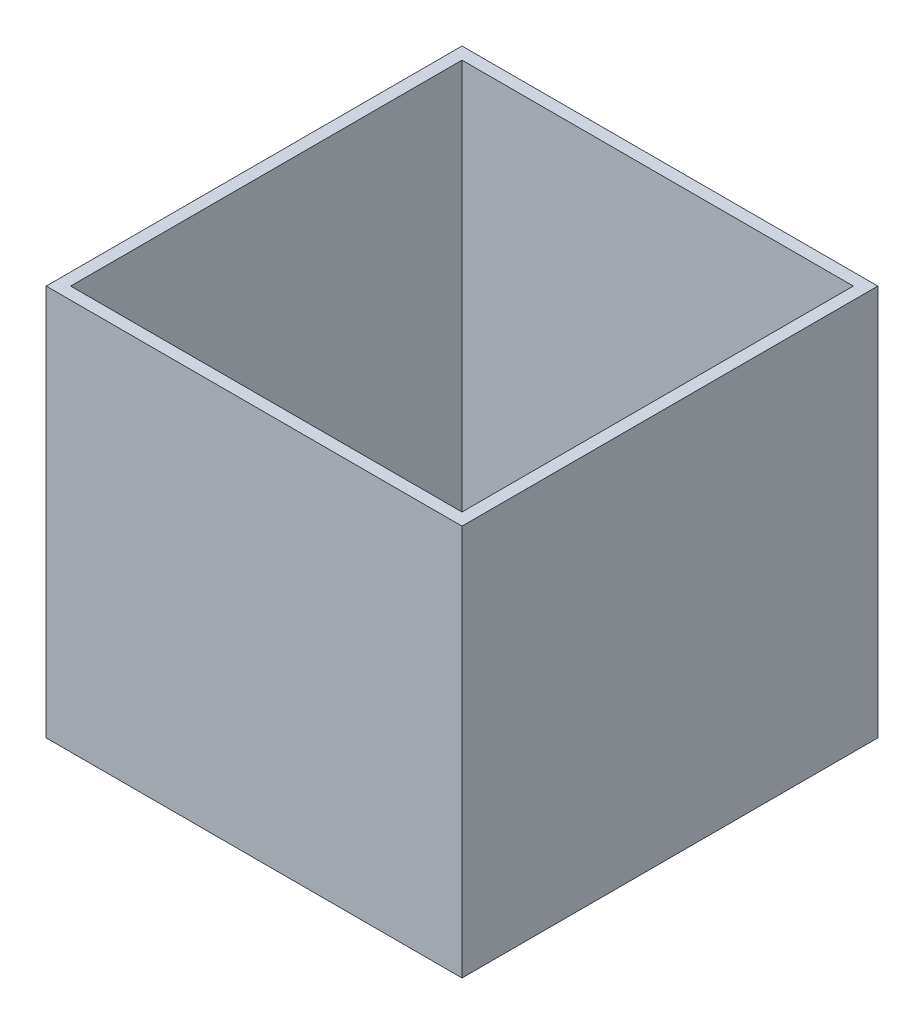
ISO-10303-21;
HEADER;
FILE_DESCRIPTION(('STEP AP214'),'2;1');
FILE_NAME('part.step','',(''),(''),'','','');
FILE_SCHEMA(('AUTOMOTIVE_DESIGN { 1 0 10303 214 1 1 1 1 }'));
ENDSEC;
DATA;
#1=APPLICATION_CONTEXT('core data for automotive mechanical design processes');
#2=APPLICATION_PROTOCOL_DEFINITION('international standard','automotive_design',2000,#1);
#3=PRODUCT_CONTEXT('',#1,'mechanical');
#4=PRODUCT('Part','Part','',(#3));
#5=PRODUCT_RELATED_PRODUCT_CATEGORY('part','',(#4));
#6=PRODUCT_DEFINITION_FORMATION('','',#4);
#7=PRODUCT_DEFINITION_CONTEXT('part definition',#1,'design');
#8=PRODUCT_DEFINITION('design','',#6,#7);
#9=PRODUCT_DEFINITION_SHAPE('','',#8);
#10=(LENGTH_UNIT() NAMED_UNIT(*) SI_UNIT(.MILLI.,.METRE.));
#11=(NAMED_UNIT(*) PLANE_ANGLE_UNIT() SI_UNIT($,.RADIAN.));
#12=(NAMED_UNIT(*) SI_UNIT($,.STERADIAN.) SOLID_ANGLE_UNIT());
#13=UNCERTAINTY_MEASURE_WITH_UNIT(LENGTH_MEASURE(1.E-05),#10,'distance_accuracy_value','');
#14=(GEOMETRIC_REPRESENTATION_CONTEXT(3) GLOBAL_UNCERTAINTY_ASSIGNED_CONTEXT((#13)) GLOBAL_UNIT_ASSIGNED_CONTEXT((#10,
#11,#12)) REPRESENTATION_CONTEXT('',''));
#15=CARTESIAN_POINT('',(0.,0.,0.));
#16=DIRECTION('',(0.,0.,1.));
#17=DIRECTION('',(1.,0.,0.));
#18=AXIS2_PLACEMENT_3D('',#15,#16,#17);
#19=CARTESIAN_POINT('',(0.,203.2,0.));
#20=DIRECTION('',(0.,1.,0.));
#21=DIRECTION('',(0.,0.,1.));
#22=AXIS2_PLACEMENT_3D('',#19,#20,#21);
#23=PLANE('',#22);
#24=DIRECTION('',(0.,0.,1.));
#25=VECTOR('',#24,1.);
#26=CARTESIAN_POINT('',(-107.95,203.2,-107.95));
#27=LINE('',#26,#25);
#28=CARTESIAN_POINT('',(-107.95,203.2,-107.95));
#29=VERTEX_POINT('',#28);
#30=CARTESIAN_POINT('',(-107.95,203.2,107.95));
#31=VERTEX_POINT('',#30);
#32=EDGE_CURVE('E137',#29,#31,#27,.T.);
#33=ORIENTED_EDGE('',*,*,#32,.T.);
#34=DIRECTION('',(1.,0.,0.));
#35=VECTOR('',#34,1.);
#36=CARTESIAN_POINT('',(-107.95,203.2,107.95));
#37=LINE('',#36,#35);
#38=CARTESIAN_POINT('',(107.95,203.2,107.95));
#39=VERTEX_POINT('',#38);
#40=EDGE_CURVE('E140',#31,#39,#37,.T.);
#41=ORIENTED_EDGE('',*,*,#40,.T.);
#42=DIRECTION('',(0.,0.,-1.));
#43=VECTOR('',#42,1.);
#44=CARTESIAN_POINT('',(107.95,203.2,-107.95));
#45=LINE('',#44,#43);
#46=CARTESIAN_POINT('',(107.95,203.2,-107.95));
#47=VERTEX_POINT('',#46);
#48=EDGE_CURVE('E143',#39,#47,#45,.T.);
#49=ORIENTED_EDGE('',*,*,#48,.T.);
#50=DIRECTION('',(-1.,0.,0.));
#51=VECTOR('',#50,1.);
#52=CARTESIAN_POINT('',(-107.95,203.2,-107.95));
#53=LINE('',#52,#51);
#54=EDGE_CURVE('E145',#47,#29,#53,.T.);
#55=ORIENTED_EDGE('',*,*,#54,.T.);
#56=EDGE_LOOP('',(#33,#41,#49,#55));
#57=FACE_BOUND('',#56,.T.);
#58=DIRECTION('',(1.,0.,0.));
#59=VECTOR('',#58,1.);
#60=CARTESIAN_POINT('',(-101.6,203.2,101.6));
#61=LINE('',#60,#59);
#62=CARTESIAN_POINT('',(-101.6,203.2,101.6));
#63=VERTEX_POINT('',#62);
#64=CARTESIAN_POINT('',(101.6,203.2,101.6));
#65=VERTEX_POINT('',#64);
#66=EDGE_CURVE('E109',#63,#65,#61,.T.);
#67=ORIENTED_EDGE('',*,*,#66,.F.);
#68=DIRECTION('',(0.,0.,1.));
#69=VECTOR('',#68,1.);
#70=CARTESIAN_POINT('',(-101.6,203.2,-101.6));
#71=LINE('',#70,#69);
#72=CARTESIAN_POINT('',(-101.6,203.2,-101.6));
#73=VERTEX_POINT('',#72);
#74=EDGE_CURVE('E101',#73,#63,#71,.T.);
#75=ORIENTED_EDGE('',*,*,#74,.F.);
#76=DIRECTION('',(-1.,0.,0.));
#77=VECTOR('',#76,1.);
#78=CARTESIAN_POINT('',(-101.6,203.2,-101.6));
#79=LINE('',#78,#77);
#80=CARTESIAN_POINT('',(101.6,203.2,-101.6));
#81=VERTEX_POINT('',#80);
#82=EDGE_CURVE('E123',#81,#73,#79,.T.);
#83=ORIENTED_EDGE('',*,*,#82,.F.);
#84=DIRECTION('',(0.,0.,-1.));
#85=VECTOR('',#84,1.);
#86=CARTESIAN_POINT('',(101.6,203.2,-101.6));
#87=LINE('',#86,#85);
#88=EDGE_CURVE('E121',#65,#81,#87,.T.);
#89=ORIENTED_EDGE('',*,*,#88,.F.);
#90=EDGE_LOOP('',(#67,#75,#83,#89));
#91=FACE_BOUND('',#90,.T.);
#92=ADVANCED_FACE('F36',(#57,#91),#23,.T.);
#93=CARTESIAN_POINT('',(0.,0.,0.));
#94=DIRECTION('',(0.,1.,0.));
#95=DIRECTION('',(0.,0.,1.));
#96=AXIS2_PLACEMENT_3D('',#93,#94,#95);
#97=PLANE('',#96);
#98=DIRECTION('',(0.,0.,1.));
#99=VECTOR('',#98,1.);
#100=CARTESIAN_POINT('',(-107.95,0.,-107.95));
#101=LINE('',#100,#99);
#102=CARTESIAN_POINT('',(-107.95,0.,-107.95));
#103=VERTEX_POINT('',#102);
#104=CARTESIAN_POINT('',(-107.95,0.,107.95));
#105=VERTEX_POINT('',#104);
#106=EDGE_CURVE('E117',#103,#105,#101,.T.);
#107=ORIENTED_EDGE('',*,*,#106,.F.);
#108=DIRECTION('',(-1.,0.,0.));
#109=VECTOR('',#108,1.);
#110=CARTESIAN_POINT('',(-107.95,0.,-107.95));
#111=LINE('',#110,#109);
#112=CARTESIAN_POINT('',(107.95,0.,-107.95));
#113=VERTEX_POINT('',#112);
#114=EDGE_CURVE('E141',#113,#103,#111,.T.);
#115=ORIENTED_EDGE('',*,*,#114,.F.);
#116=DIRECTION('',(0.,0.,-1.));
#117=VECTOR('',#116,1.);
#118=CARTESIAN_POINT('',(107.95,0.,-107.95));
#119=LINE('',#118,#117);
#120=CARTESIAN_POINT('',(107.95,0.,107.95));
#121=VERTEX_POINT('',#120);
#122=EDGE_CURVE('E152',#121,#113,#119,.T.);
#123=ORIENTED_EDGE('',*,*,#122,.F.);
#124=DIRECTION('',(1.,0.,0.));
#125=VECTOR('',#124,1.);
#126=CARTESIAN_POINT('',(-107.95,0.,107.95));
#127=LINE('',#126,#125);
#128=EDGE_CURVE('E150',#105,#121,#127,.T.);
#129=ORIENTED_EDGE('',*,*,#128,.F.);
#130=EDGE_LOOP('',(#107,#115,#123,#129));
#131=FACE_BOUND('',#130,.T.);
#132=DIRECTION('',(0.,0.,1.));
#133=VECTOR('',#132,1.);
#134=CARTESIAN_POINT('',(-101.6,0.,-101.6));
#135=LINE('',#134,#133);
#136=CARTESIAN_POINT('',(-101.6,0.,-101.6));
#137=VERTEX_POINT('',#136);
#138=CARTESIAN_POINT('',(-101.6,0.,101.6));
#139=VERTEX_POINT('',#138);
#140=EDGE_CURVE('E59',#137,#139,#135,.T.);
#141=ORIENTED_EDGE('',*,*,#140,.T.);
#142=DIRECTION('',(1.,0.,0.));
#143=VECTOR('',#142,1.);
#144=CARTESIAN_POINT('',(-101.6,0.,101.6));
#145=LINE('',#144,#143);
#146=CARTESIAN_POINT('',(101.6,0.,101.6));
#147=VERTEX_POINT('',#146);
#148=EDGE_CURVE('E116',#139,#147,#145,.T.);
#149=ORIENTED_EDGE('',*,*,#148,.T.);
#150=DIRECTION('',(0.,0.,-1.));
#151=VECTOR('',#150,1.);
#152=CARTESIAN_POINT('',(101.6,0.,-101.6));
#153=LINE('',#152,#151);
#154=CARTESIAN_POINT('',(101.6,0.,-101.6));
#155=VERTEX_POINT('',#154);
#156=EDGE_CURVE('E129',#147,#155,#153,.T.);
#157=ORIENTED_EDGE('',*,*,#156,.T.);
#158=DIRECTION('',(-1.,0.,0.));
#159=VECTOR('',#158,1.);
#160=CARTESIAN_POINT('',(-101.6,0.,-101.6));
#161=LINE('',#160,#159);
#162=EDGE_CURVE('E110',#155,#137,#161,.T.);
#163=ORIENTED_EDGE('',*,*,#162,.T.);
#164=EDGE_LOOP('',(#141,#149,#157,#163));
#165=FACE_BOUND('',#164,.T.);
#166=ADVANCED_FACE('F170',(#131,#165),#97,.F.);
#167=CARTESIAN_POINT('',(-107.95,203.2,-107.95));
#168=DIRECTION('',(1.,0.,0.));
#169=DIRECTION('',(0.,0.,-1.));
#170=AXIS2_PLACEMENT_3D('',#167,#168,#169);
#171=PLANE('',#170);
#172=ORIENTED_EDGE('',*,*,#106,.T.);
#173=DIRECTION('',(0.,-1.,0.));
#174=VECTOR('',#173,1.);
#175=CARTESIAN_POINT('',(-107.95,203.2,107.95));
#176=LINE('',#175,#174);
#177=EDGE_CURVE('E11',#31,#105,#176,.T.);
#178=ORIENTED_EDGE('',*,*,#177,.F.);
#179=ORIENTED_EDGE('',*,*,#32,.F.);
#180=DIRECTION('',(0.,-1.,0.));
#181=VECTOR('',#180,1.);
#182=CARTESIAN_POINT('',(-107.95,203.2,-107.95));
#183=LINE('',#182,#181);
#184=EDGE_CURVE('E147',#29,#103,#183,.T.);
#185=ORIENTED_EDGE('',*,*,#184,.T.);
#186=EDGE_LOOP('',(#172,#178,#179,#185));
#187=FACE_BOUND('',#186,.T.);
#188=ADVANCED_FACE('F38',(#187),#171,.F.);
#189=CARTESIAN_POINT('',(-107.95,203.2,107.95));
#190=DIRECTION('',(0.,0.,-1.));
#191=DIRECTION('',(-1.,0.,0.));
#192=AXIS2_PLACEMENT_3D('',#189,#190,#191);
#193=PLANE('',#192);
#194=ORIENTED_EDGE('',*,*,#128,.T.);
#195=DIRECTION('',(0.,-1.,0.));
#196=VECTOR('',#195,1.);
#197=CARTESIAN_POINT('',(107.95,203.2,107.95));
#198=LINE('',#197,#196);
#199=EDGE_CURVE('E44',#39,#121,#198,.T.);
#200=ORIENTED_EDGE('',*,*,#199,.F.);
#201=ORIENTED_EDGE('',*,*,#40,.F.);
#202=ORIENTED_EDGE('',*,*,#177,.T.);
#203=EDGE_LOOP('',(#194,#200,#201,#202));
#204=FACE_BOUND('',#203,.T.);
#205=ADVANCED_FACE('F180',(#204),#193,.F.);
#206=CARTESIAN_POINT('',(107.95,203.2,-107.95));
#207=DIRECTION('',(-1.,0.,0.));
#208=DIRECTION('',(0.,0.,1.));
#209=AXIS2_PLACEMENT_3D('',#206,#207,#208);
#210=PLANE('',#209);
#211=ORIENTED_EDGE('',*,*,#122,.T.);
#212=DIRECTION('',(0.,-1.,0.));
#213=VECTOR('',#212,1.);
#214=CARTESIAN_POINT('',(107.95,203.2,-107.95));
#215=LINE('',#214,#213);
#216=EDGE_CURVE('E157',#47,#113,#215,.T.);
#217=ORIENTED_EDGE('',*,*,#216,.F.);
#218=ORIENTED_EDGE('',*,*,#48,.F.);
#219=ORIENTED_EDGE('',*,*,#199,.T.);
#220=EDGE_LOOP('',(#211,#217,#218,#219));
#221=FACE_BOUND('',#220,.T.);
#222=ADVANCED_FACE('F164',(#221),#210,.F.);
#223=CARTESIAN_POINT('',(-107.95,203.2,-107.95));
#224=DIRECTION('',(0.,0.,1.));
#225=DIRECTION('',(1.,0.,0.));
#226=AXIS2_PLACEMENT_3D('',#223,#224,#225);
#227=PLANE('',#226);
#228=ORIENTED_EDGE('',*,*,#114,.T.);
#229=ORIENTED_EDGE('',*,*,#184,.F.);
#230=ORIENTED_EDGE('',*,*,#54,.F.);
#231=ORIENTED_EDGE('',*,*,#216,.T.);
#232=EDGE_LOOP('',(#228,#229,#230,#231));
#233=FACE_BOUND('',#232,.T.);
#234=ADVANCED_FACE('F174',(#233),#227,.F.);
#235=CARTESIAN_POINT('',(-101.6,203.2,-101.6));
#236=DIRECTION('',(1.,0.,0.));
#237=DIRECTION('',(0.,0.,-1.));
#238=AXIS2_PLACEMENT_3D('',#235,#236,#237);
#239=PLANE('',#238);
#240=ORIENTED_EDGE('',*,*,#140,.F.);
#241=DIRECTION('',(0.,-1.,0.));
#242=VECTOR('',#241,1.);
#243=CARTESIAN_POINT('',(-101.6,203.2,-101.6));
#244=LINE('',#243,#242);
#245=EDGE_CURVE('E105',#73,#137,#244,.T.);
#246=ORIENTED_EDGE('',*,*,#245,.F.);
#247=ORIENTED_EDGE('',*,*,#74,.T.);
#248=DIRECTION('',(0.,-1.,0.));
#249=VECTOR('',#248,1.);
#250=CARTESIAN_POINT('',(-101.6,203.2,101.6));
#251=LINE('',#250,#249);
#252=EDGE_CURVE('E104',#63,#139,#251,.T.);
#253=ORIENTED_EDGE('',*,*,#252,.T.);
#254=EDGE_LOOP('',(#240,#246,#247,#253));
#255=FACE_BOUND('',#254,.T.);
#256=ADVANCED_FACE('F103',(#255),#239,.T.);
#257=CARTESIAN_POINT('',(-101.6,203.2,101.6));
#258=DIRECTION('',(0.,0.,-1.));
#259=DIRECTION('',(-1.,0.,0.));
#260=AXIS2_PLACEMENT_3D('',#257,#258,#259);
#261=PLANE('',#260);
#262=ORIENTED_EDGE('',*,*,#148,.F.);
#263=ORIENTED_EDGE('',*,*,#252,.F.);
#264=ORIENTED_EDGE('',*,*,#66,.T.);
#265=DIRECTION('',(0.,-1.,0.));
#266=VECTOR('',#265,1.);
#267=CARTESIAN_POINT('',(101.6,203.2,101.6));
#268=LINE('',#267,#266);
#269=EDGE_CURVE('E118',#65,#147,#268,.T.);
#270=ORIENTED_EDGE('',*,*,#269,.T.);
#271=EDGE_LOOP('',(#262,#263,#264,#270));
#272=FACE_BOUND('',#271,.T.);
#273=ADVANCED_FACE('F113',(#272),#261,.T.);
#274=CARTESIAN_POINT('',(101.6,203.2,-101.6));
#275=DIRECTION('',(-1.,0.,0.));
#276=DIRECTION('',(0.,0.,1.));
#277=AXIS2_PLACEMENT_3D('',#274,#275,#276);
#278=PLANE('',#277);
#279=ORIENTED_EDGE('',*,*,#156,.F.);
#280=ORIENTED_EDGE('',*,*,#269,.F.);
#281=ORIENTED_EDGE('',*,*,#88,.T.);
#282=DIRECTION('',(0.,-1.,0.));
#283=VECTOR('',#282,1.);
#284=CARTESIAN_POINT('',(101.6,203.2,-101.6));
#285=LINE('',#284,#283);
#286=EDGE_CURVE('E51',#81,#155,#285,.T.);
#287=ORIENTED_EDGE('',*,*,#286,.T.);
#288=EDGE_LOOP('',(#279,#280,#281,#287));
#289=FACE_BOUND('',#288,.T.);
#290=ADVANCED_FACE('F203',(#289),#278,.T.);
#291=CARTESIAN_POINT('',(-101.6,203.2,-101.6));
#292=DIRECTION('',(0.,0.,1.));
#293=DIRECTION('',(1.,0.,0.));
#294=AXIS2_PLACEMENT_3D('',#291,#292,#293);
#295=PLANE('',#294);
#296=ORIENTED_EDGE('',*,*,#162,.F.);
#297=ORIENTED_EDGE('',*,*,#286,.F.);
#298=ORIENTED_EDGE('',*,*,#82,.T.);
#299=ORIENTED_EDGE('',*,*,#245,.T.);
#300=EDGE_LOOP('',(#296,#297,#298,#299));
#301=FACE_BOUND('',#300,.T.);
#302=ADVANCED_FACE('F207',(#301),#295,.T.);
#303=CLOSED_SHELL('',(#92,#166,#188,#205,#222,#234,#256,#273,#290,#302));
#304=MANIFOLD_SOLID_BREP('B2',#303);
#305=ADVANCED_BREP_SHAPE_REPRESENTATION('',(#18,#304),#14);
#306=SHAPE_DEFINITION_REPRESENTATION(#9,#305);
ENDSEC;
END-ISO-10303-21;
